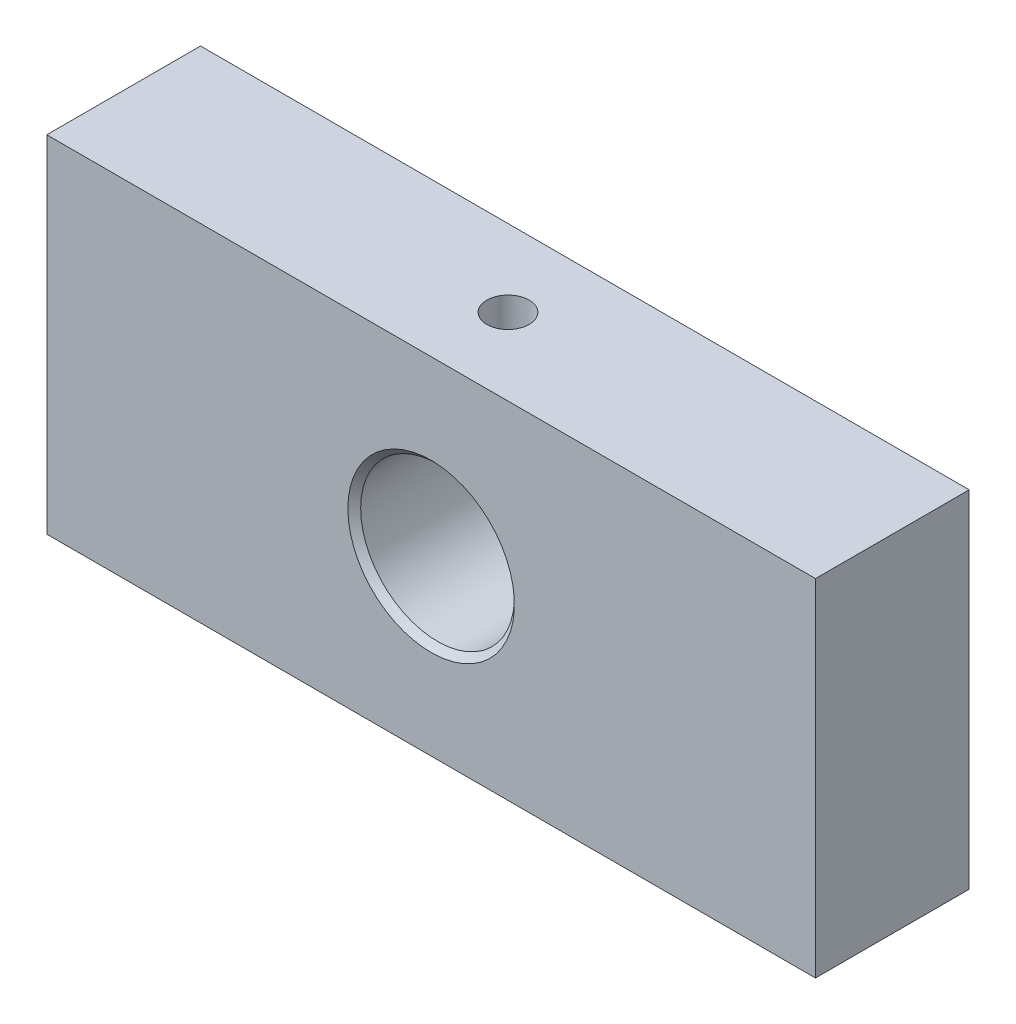
ISO-10303-21;
HEADER;
FILE_DESCRIPTION(('STEP AP214'),'2;1');
FILE_NAME('part.step','',(''),(''),'','','');
FILE_SCHEMA(('AUTOMOTIVE_DESIGN { 1 0 10303 214 1 1 1 1 }'));
ENDSEC;
DATA;
#1=APPLICATION_CONTEXT('core data for automotive mechanical design processes');
#2=APPLICATION_PROTOCOL_DEFINITION('international standard','automotive_design',2000,#1);
#3=PRODUCT_CONTEXT('',#1,'mechanical');
#4=PRODUCT('Part','Part','',(#3));
#5=PRODUCT_RELATED_PRODUCT_CATEGORY('part','',(#4));
#6=PRODUCT_DEFINITION_FORMATION('','',#4);
#7=PRODUCT_DEFINITION_CONTEXT('part definition',#1,'design');
#8=PRODUCT_DEFINITION('design','',#6,#7);
#9=PRODUCT_DEFINITION_SHAPE('','',#8);
#10=(LENGTH_UNIT() NAMED_UNIT(*) SI_UNIT(.MILLI.,.METRE.));
#11=(NAMED_UNIT(*) PLANE_ANGLE_UNIT() SI_UNIT($,.RADIAN.));
#12=(NAMED_UNIT(*) SI_UNIT($,.STERADIAN.) SOLID_ANGLE_UNIT());
#13=UNCERTAINTY_MEASURE_WITH_UNIT(LENGTH_MEASURE(1.E-05),#10,'distance_accuracy_value','');
#14=(GEOMETRIC_REPRESENTATION_CONTEXT(3) GLOBAL_UNCERTAINTY_ASSIGNED_CONTEXT((#13)) GLOBAL_UNIT_ASSIGNED_CONTEXT((#10,
#11,#12)) REPRESENTATION_CONTEXT('',''));
#15=CARTESIAN_POINT('',(0.,0.,0.));
#16=DIRECTION('',(0.,0.,1.));
#17=DIRECTION('',(1.,0.,0.));
#18=AXIS2_PLACEMENT_3D('',#15,#16,#17);
#19=CARTESIAN_POINT('',(0.,0.,12.));
#20=DIRECTION('',(1.,0.,0.));
#21=DIRECTION('',(0.,0.,-1.));
#22=AXIS2_PLACEMENT_3D('',#19,#20,#21);
#23=PLANE('',#22);
#24=DIRECTION('',(0.,-1.,0.));
#25=VECTOR('',#24,1.);
#26=CARTESIAN_POINT('',(0.,0.,0.));
#27=LINE('',#26,#25);
#28=CARTESIAN_POINT('',(0.,27.,0.));
#29=VERTEX_POINT('',#28);
#30=CARTESIAN_POINT('',(0.,0.,0.));
#31=VERTEX_POINT('',#30);
#32=EDGE_CURVE('E138',#29,#31,#27,.T.);
#33=ORIENTED_EDGE('',*,*,#32,.T.);
#34=DIRECTION('',(0.,0.,-1.));
#35=VECTOR('',#34,1.);
#36=CARTESIAN_POINT('',(0.,0.,12.));
#37=LINE('',#36,#35);
#38=CARTESIAN_POINT('',(0.,0.,12.));
#39=VERTEX_POINT('',#38);
#40=EDGE_CURVE('E157',#39,#31,#37,.T.);
#41=ORIENTED_EDGE('',*,*,#40,.F.);
#42=DIRECTION('',(0.,-1.,0.));
#43=VECTOR('',#42,1.);
#44=CARTESIAN_POINT('',(0.,0.,12.));
#45=LINE('',#44,#43);
#46=CARTESIAN_POINT('',(0.,27.,12.));
#47=VERTEX_POINT('',#46);
#48=EDGE_CURVE('E139',#47,#39,#45,.T.);
#49=ORIENTED_EDGE('',*,*,#48,.F.);
#50=DIRECTION('',(0.,0.,-1.));
#51=VECTOR('',#50,1.);
#52=CARTESIAN_POINT('',(0.,27.,12.));
#53=LINE('',#52,#51);
#54=EDGE_CURVE('E145',#47,#29,#53,.T.);
#55=ORIENTED_EDGE('',*,*,#54,.T.);
#56=EDGE_LOOP('',(#33,#41,#49,#55));
#57=FACE_BOUND('',#56,.T.);
#58=ADVANCED_FACE('F36',(#57),#23,.F.);
#59=CARTESIAN_POINT('',(0.,0.,12.));
#60=DIRECTION('',(0.,1.,0.));
#61=DIRECTION('',(0.,0.,1.));
#62=AXIS2_PLACEMENT_3D('',#59,#60,#61);
#63=PLANE('',#62);
#64=CARTESIAN_POINT('',(52.,0.,6.00000000000061));
#65=DIRECTION('',(0.,-1.,0.));
#66=DIRECTION('',(0.,0.,-1.));
#67=AXIS2_PLACEMENT_3D('',#64,#65,#66);
#68=CIRCLE('',#67,2.5);
#69=CARTESIAN_POINT('',(52.,0.,3.50000000000061));
#70=VERTEX_POINT('',#69);
#71=EDGE_CURVE('E109',#70,#70,#68,.T.);
#72=ORIENTED_EDGE('',*,*,#71,.F.);
#73=EDGE_LOOP('',(#72));
#74=FACE_BOUND('',#73,.T.);
#75=CARTESIAN_POINT('',(44.,0.,6.00000000000061));
#76=DIRECTION('',(0.,-1.,0.));
#77=DIRECTION('',(0.,0.,-1.));
#78=AXIS2_PLACEMENT_3D('',#75,#76,#77);
#79=CIRCLE('',#78,2.09999999999999);
#80=CARTESIAN_POINT('',(44.,0.,3.90000000000062));
#81=VERTEX_POINT('',#80);
#82=EDGE_CURVE('E108',#81,#81,#79,.T.);
#83=ORIENTED_EDGE('',*,*,#82,.F.);
#84=EDGE_LOOP('',(#83));
#85=FACE_BOUND('',#84,.T.);
#86=CARTESIAN_POINT('',(16.,0.,6.));
#87=DIRECTION('',(0.,-1.,0.));
#88=DIRECTION('',(0.,0.,-1.));
#89=AXIS2_PLACEMENT_3D('',#86,#87,#88);
#90=CIRCLE('',#89,2.1);
#91=CARTESIAN_POINT('',(16.,0.,3.9));
#92=VERTEX_POINT('',#91);
#93=EDGE_CURVE('E119',#92,#92,#90,.T.);
#94=ORIENTED_EDGE('',*,*,#93,.F.);
#95=EDGE_LOOP('',(#94));
#96=FACE_BOUND('',#95,.T.);
#97=CARTESIAN_POINT('',(8.,0.,6.));
#98=DIRECTION('',(0.,-1.,0.));
#99=DIRECTION('',(0.,0.,-1.));
#100=AXIS2_PLACEMENT_3D('',#97,#98,#99);
#101=CIRCLE('',#100,2.49999999999999);
#102=CARTESIAN_POINT('',(8.,0.,3.50000000000001));
#103=VERTEX_POINT('',#102);
#104=EDGE_CURVE('E125',#103,#103,#101,.T.);
#105=ORIENTED_EDGE('',*,*,#104,.F.);
#106=EDGE_LOOP('',(#105));
#107=FACE_BOUND('',#106,.T.);
#108=DIRECTION('',(1.,0.,0.));
#109=VECTOR('',#108,1.);
#110=CARTESIAN_POINT('',(0.,0.,0.));
#111=LINE('',#110,#109);
#112=CARTESIAN_POINT('',(60.,0.,0.));
#113=VERTEX_POINT('',#112);
#114=EDGE_CURVE('E148',#31,#113,#111,.T.);
#115=ORIENTED_EDGE('',*,*,#114,.T.);
#116=DIRECTION('',(0.,0.,-1.));
#117=VECTOR('',#116,1.);
#118=CARTESIAN_POINT('',(60.,0.,12.));
#119=LINE('',#118,#117);
#120=CARTESIAN_POINT('',(60.,0.,12.));
#121=VERTEX_POINT('',#120);
#122=EDGE_CURVE('E155',#121,#113,#119,.T.);
#123=ORIENTED_EDGE('',*,*,#122,.F.);
#124=DIRECTION('',(1.,0.,0.));
#125=VECTOR('',#124,1.);
#126=CARTESIAN_POINT('',(0.,0.,12.));
#127=LINE('',#126,#125);
#128=EDGE_CURVE('E85',#39,#121,#127,.T.);
#129=ORIENTED_EDGE('',*,*,#128,.F.);
#130=ORIENTED_EDGE('',*,*,#40,.T.);
#131=EDGE_LOOP('',(#115,#123,#129,#130));
#132=FACE_BOUND('',#131,.T.);
#133=ADVANCED_FACE('F201',(#74,#85,#96,#107,#132),#63,.F.);
#134=CARTESIAN_POINT('',(60.,0.,12.));
#135=DIRECTION('',(-1.,0.,0.));
#136=DIRECTION('',(0.,0.,1.));
#137=AXIS2_PLACEMENT_3D('',#134,#135,#136);
#138=PLANE('',#137);
#139=DIRECTION('',(0.,1.,0.));
#140=VECTOR('',#139,1.);
#141=CARTESIAN_POINT('',(60.,0.,0.));
#142=LINE('',#141,#140);
#143=CARTESIAN_POINT('',(60.,27.,0.));
#144=VERTEX_POINT('',#143);
#145=EDGE_CURVE('E71',#113,#144,#142,.T.);
#146=ORIENTED_EDGE('',*,*,#145,.T.);
#147=DIRECTION('',(0.,0.,-1.));
#148=VECTOR('',#147,1.);
#149=CARTESIAN_POINT('',(60.,27.,12.));
#150=LINE('',#149,#148);
#151=CARTESIAN_POINT('',(60.,27.,12.));
#152=VERTEX_POINT('',#151);
#153=EDGE_CURVE('E153',#152,#144,#150,.T.);
#154=ORIENTED_EDGE('',*,*,#153,.F.);
#155=DIRECTION('',(0.,1.,0.));
#156=VECTOR('',#155,1.);
#157=CARTESIAN_POINT('',(60.,0.,12.));
#158=LINE('',#157,#156);
#159=EDGE_CURVE('E142',#121,#152,#158,.T.);
#160=ORIENTED_EDGE('',*,*,#159,.F.);
#161=ORIENTED_EDGE('',*,*,#122,.T.);
#162=EDGE_LOOP('',(#146,#154,#160,#161));
#163=FACE_BOUND('',#162,.T.);
#164=ADVANCED_FACE('F206',(#163),#138,.F.);
#165=CARTESIAN_POINT('',(0.,27.,12.));
#166=DIRECTION('',(0.,-1.,0.));
#167=DIRECTION('',(1.,0.,0.));
#168=AXIS2_PLACEMENT_3D('',#165,#166,#167);
#169=PLANE('',#168);
#170=CARTESIAN_POINT('',(30.,27.,6.));
#171=DIRECTION('',(0.,1.,0.));
#172=DIRECTION('',(0.,0.,1.));
#173=AXIS2_PLACEMENT_3D('',#170,#171,#172);
#174=CIRCLE('',#173,1.64999999999999);
#175=CARTESIAN_POINT('',(30.,27.,7.64999999999999));
#176=VERTEX_POINT('',#175);
#177=EDGE_CURVE('E131',#176,#176,#174,.T.);
#178=ORIENTED_EDGE('',*,*,#177,.F.);
#179=EDGE_LOOP('',(#178));
#180=FACE_BOUND('',#179,.T.);
#181=DIRECTION('',(-1.,0.,0.));
#182=VECTOR('',#181,1.);
#183=CARTESIAN_POINT('',(0.,27.,0.));
#184=LINE('',#183,#182);
#185=EDGE_CURVE('E77',#144,#29,#184,.T.);
#186=ORIENTED_EDGE('',*,*,#185,.T.);
#187=ORIENTED_EDGE('',*,*,#54,.F.);
#188=DIRECTION('',(-1.,0.,0.));
#189=VECTOR('',#188,1.);
#190=CARTESIAN_POINT('',(0.,27.,12.));
#191=LINE('',#190,#189);
#192=EDGE_CURVE('E53',#152,#47,#191,.T.);
#193=ORIENTED_EDGE('',*,*,#192,.F.);
#194=ORIENTED_EDGE('',*,*,#153,.T.);
#195=EDGE_LOOP('',(#186,#187,#193,#194));
#196=FACE_BOUND('',#195,.T.);
#197=ADVANCED_FACE('F212',(#180,#196),#169,.F.);
#198=CARTESIAN_POINT('',(0.,0.,12.));
#199=DIRECTION('',(0.,0.,-1.));
#200=DIRECTION('',(-1.,0.,0.));
#201=AXIS2_PLACEMENT_3D('',#198,#199,#200);
#202=PLANE('',#201);
#203=CARTESIAN_POINT('',(30.,13.5,12.));
#204=DIRECTION('',(0.,0.,-1.));
#205=DIRECTION('',(-1.,0.,0.));
#206=AXIS2_PLACEMENT_3D('',#203,#204,#205);
#207=CIRCLE('',#206,6.5);
#208=CARTESIAN_POINT('',(23.5,13.5,12.));
#209=VERTEX_POINT('',#208);
#210=EDGE_CURVE('E11',#209,#209,#207,.T.);
#211=ORIENTED_EDGE('',*,*,#210,.T.);
#212=EDGE_LOOP('',(#211));
#213=FACE_BOUND('',#212,.T.);
#214=ORIENTED_EDGE('',*,*,#48,.T.);
#215=ORIENTED_EDGE('',*,*,#128,.T.);
#216=ORIENTED_EDGE('',*,*,#159,.T.);
#217=ORIENTED_EDGE('',*,*,#192,.T.);
#218=EDGE_LOOP('',(#214,#215,#216,#217));
#219=FACE_BOUND('',#218,.T.);
#220=ADVANCED_FACE('F215',(#213,#219),#202,.F.);
#221=CARTESIAN_POINT('',(0.,0.,0.));
#222=DIRECTION('',(0.,0.,-1.));
#223=DIRECTION('',(-1.,0.,0.));
#224=AXIS2_PLACEMENT_3D('',#221,#222,#223);
#225=PLANE('',#224);
#226=CARTESIAN_POINT('',(30.,13.5,0.));
#227=DIRECTION('',(0.,0.,-1.));
#228=DIRECTION('',(-1.,0.,0.));
#229=AXIS2_PLACEMENT_3D('',#226,#227,#228);
#230=CIRCLE('',#229,6.);
#231=CARTESIAN_POINT('',(24.,13.5,0.));
#232=VERTEX_POINT('',#231);
#233=EDGE_CURVE('E135',#232,#232,#230,.T.);
#234=ORIENTED_EDGE('',*,*,#233,.F.);
#235=EDGE_LOOP('',(#234));
#236=FACE_BOUND('',#235,.T.);
#237=ORIENTED_EDGE('',*,*,#32,.F.);
#238=ORIENTED_EDGE('',*,*,#185,.F.);
#239=ORIENTED_EDGE('',*,*,#145,.F.);
#240=ORIENTED_EDGE('',*,*,#114,.F.);
#241=EDGE_LOOP('',(#237,#238,#239,#240));
#242=FACE_BOUND('',#241,.T.);
#243=ADVANCED_FACE('F217',(#236,#242),#225,.T.);
#244=CARTESIAN_POINT('',(30.,13.5,12.));
#245=DIRECTION('',(0.,0.,1.));
#246=DIRECTION('',(1.,0.,0.));
#247=AXIS2_PLACEMENT_3D('',#244,#245,#246);
#248=CYLINDRICAL_SURFACE('',#247,6.);
#249=CARTESIAN_POINT('',(30.,13.5,11.5));
#250=DIRECTION('',(0.,0.,-1.));
#251=DIRECTION('',(-1.,0.,0.));
#252=AXIS2_PLACEMENT_3D('',#249,#250,#251);
#253=CIRCLE('',#252,6.);
#254=CARTESIAN_POINT('',(24.,13.5,11.5));
#255=VERTEX_POINT('',#254);
#256=EDGE_CURVE('E45',#255,#255,#253,.F.);
#257=ORIENTED_EDGE('',*,*,#256,.T.);
#258=EDGE_LOOP('',(#257));
#259=FACE_BOUND('',#258,.T.);
#260=CARTESIAN_POINT('',(30.,19.5,7.64999999999999));
#261=CARTESIAN_POINT('',(30.0908537283277,19.4999987430826,7.64999807099644));
#262=CARTESIAN_POINT('',(30.1817277335756,19.4979162279046,7.64247089912751));
#263=CARTESIAN_POINT('',(30.3608510125564,19.4898111762403,7.61261870180665));
#264=CARTESIAN_POINT('',(30.4490991219936,19.4837869184586,7.59028721149157));
#265=CARTESIAN_POINT('',(30.6203596755003,19.4684621535668,7.53161251353508));
#266=CARTESIAN_POINT('',(30.7033789364245,19.4591660207935,7.495288007773));
#267=CARTESIAN_POINT('',(30.8621475322751,19.4382760100701,7.40972952683831));
#268=CARTESIAN_POINT('',(30.93789626133,19.4266819408736,7.36049447707182));
#269=CARTESIAN_POINT('',(31.0818313678109,19.4021262456901,7.24923811997339));
#270=CARTESIAN_POINT('',(31.1498140535122,19.3891400932963,7.18695870420412));
#271=CARTESIAN_POINT('',(31.274513622207,19.3634185780897,7.05193283429948));
#272=CARTESIAN_POINT('',(31.3312289552196,19.350683249998,6.97918494245));
#273=CARTESIAN_POINT('',(31.4327956828804,19.3266524492101,6.82363800281993));
#274=CARTESIAN_POINT('',(31.4774093410968,19.3153878141438,6.74067851730474));
#275=CARTESIAN_POINT('',(31.551973735683,19.2959358909451,6.56807591951321));
#276=CARTESIAN_POINT('',(31.5819273676161,19.2877479951875,6.47843413112039));
#277=CARTESIAN_POINT('',(31.6256075000386,19.2756304093822,6.29727533624054));
#278=CARTESIAN_POINT('',(31.6397048488695,19.2716035913248,6.20585440576672));
#279=CARTESIAN_POINT('',(31.6524289066658,19.2679741883931,6.02186326388271));
#280=CARTESIAN_POINT('',(31.6510587063326,19.268370719652,5.92929328576605));
#281=CARTESIAN_POINT('',(31.6331802186321,19.2734564821543,5.74855455128155));
#282=CARTESIAN_POINT('',(31.6171243582028,19.2780174118175,5.66033685132934));
#283=CARTESIAN_POINT('',(31.571056457029,19.290712125433,5.4878984571429));
#284=CARTESIAN_POINT('',(31.5410432379396,19.2988462110443,5.40367810104466));
#285=CARTESIAN_POINT('',(31.4675525740361,19.3178810068791,5.24046335350015));
#286=CARTESIAN_POINT('',(31.4239194027705,19.3288134380864,5.16154293706776));
#287=CARTESIAN_POINT('',(31.3245359421656,19.3521965018176,5.01198691032996));
#288=CARTESIAN_POINT('',(31.2687831320586,19.3646474499414,4.94135302825628));
#289=CARTESIAN_POINT('',(31.1444455786362,19.3901954366764,4.80779451200269));
#290=CARTESIAN_POINT('',(31.0754819378021,19.4032998839593,4.74522350991207));
#291=CARTESIAN_POINT('',(30.9278791741358,19.4282910595904,4.63245990828775));
#292=CARTESIAN_POINT('',(30.8492396207584,19.4401777337085,4.58226785987435));
#293=CARTESIAN_POINT('',(30.6839470274225,19.4614750412231,4.49551741834778));
#294=CARTESIAN_POINT('',(30.5972569014141,19.4708733610395,4.45902646630247));
#295=CARTESIAN_POINT('',(30.4186541320437,19.4860461745055,4.40124030070411));
#296=CARTESIAN_POINT('',(30.3267427102351,19.4918215119967,4.37994154852353));
#297=CARTESIAN_POINT('',(30.1433215062691,19.4989686066969,4.35370760850692));
#298=CARTESIAN_POINT('',(30.0518853661978,19.5004696048813,4.34829201366682));
#299=CARTESIAN_POINT('',(29.8694101154025,19.4992722923156,4.35264666541254));
#300=CARTESIAN_POINT('',(29.778370961941,19.4965744453723,4.36241523474668));
#301=CARTESIAN_POINT('',(29.601012229792,19.4873663592129,4.3964680614825));
#302=CARTESIAN_POINT('',(29.514636576121,19.4809273447506,4.42048130178517));
#303=CARTESIAN_POINT('',(29.3471503323881,19.4649703176669,4.48202439492076));
#304=CARTESIAN_POINT('',(29.2660403316882,19.455451961099,4.51955575771149));
#305=CARTESIAN_POINT('',(29.1095447040823,19.4340929771281,4.60794021664958));
#306=CARTESIAN_POINT('',(29.0343104963562,19.4222087468833,4.65905061369239));
#307=CARTESIAN_POINT('',(28.8933190328873,19.3974900917771,4.77282154032141));
#308=CARTESIAN_POINT('',(28.8275637769132,19.3846554672735,4.83548450080895));
#309=CARTESIAN_POINT('',(28.7053498427899,19.3590019124566,4.97282845250336));
#310=CARTESIAN_POINT('',(28.6492309619935,19.3461951063632,5.04781465907046));
#311=CARTESIAN_POINT('',(28.5503617951009,19.3224688821406,5.20641351333614));
#312=CARTESIAN_POINT('',(28.5076109842016,19.3115493899268,5.29002582222028));
#313=CARTESIAN_POINT('',(28.4370108318927,19.2929611165989,5.46311233018454));
#314=CARTESIAN_POINT('',(28.4090777273075,19.2852741148417,5.55255029883062));
#315=CARTESIAN_POINT('',(28.3687238079795,19.2740267763645,5.7351035374625));
#316=CARTESIAN_POINT('',(28.3562987183312,19.27046530243,5.82821778674824));
#317=CARTESIAN_POINT('',(28.347570682498,19.2679714749196,6.01198988281324));
#318=CARTESIAN_POINT('',(28.3507198563064,19.2688818021384,6.10261995085517));
#319=CARTESIAN_POINT('',(28.3717712015682,19.2748582836978,6.2820034160007));
#320=CARTESIAN_POINT('',(28.3896729465519,19.2799243179044,6.37075686727777));
#321=CARTESIAN_POINT('',(28.4393945044271,19.2935447800639,6.54312897734824));
#322=CARTESIAN_POINT('',(28.471091273794,19.3020683243948,6.62678574265721));
#323=CARTESIAN_POINT('',(28.5474079003887,19.3216424785397,6.78765860998809));
#324=CARTESIAN_POINT('',(28.5920298998629,19.3326935071987,6.86487364161305));
#325=CARTESIAN_POINT('',(28.6945613212916,19.356507274906,7.01326917305464));
#326=CARTESIAN_POINT('',(28.7528412699432,19.3693126029988,7.08418685503001));
#327=CARTESIAN_POINT('',(28.8803386614604,19.3949622475491,7.21541371112339));
#328=CARTESIAN_POINT('',(28.9495587983537,19.4078065728436,7.27572026449428));
#329=CARTESIAN_POINT('',(29.0989077497507,19.4324434176161,7.38539259257943));
#330=CARTESIAN_POINT('',(29.1792522908768,19.4442046427709,7.43447225610963));
#331=CARTESIAN_POINT('',(29.3473741273614,19.4650006337912,7.51835186671289));
#332=CARTESIAN_POINT('',(29.435146915075,19.4740370381673,7.55316039996171));
#333=CARTESIAN_POINT('',(29.602080341257,19.4872859746761,7.60330363251497));
#334=CARTESIAN_POINT('',(29.6805650834511,19.4920179104802,7.62077254795139));
#335=CARTESIAN_POINT('',(29.8393614051269,19.4983753034331,7.64412093024871));
#336=CARTESIAN_POINT('',(29.9196727773314,19.5000011112883,7.6500017055051));
#337=CARTESIAN_POINT('',(30.,19.5,7.64999999999999));
#338=B_SPLINE_CURVE_WITH_KNOTS('',3,(#260,#261,#262,#263,#264,#265,#266,#267,#268,#269,#270,
#271,#272,#273,#274,#275,#276,#277,#278,#279,#280,#281,#282,#283,#284,#285,#286,#287,#288,#289,
#290,#291,#292,#293,#294,#295,#296,#297,#298,#299,#300,#301,#302,#303,#304,#305,#306,#307,#308,
#309,#310,#311,#312,#313,#314,#315,#316,#317,#318,#319,#320,#321,#322,#323,#324,#325,#326,#327,
#328,#329,#330,#331,#332,#333,#334,#335,#336,#337),.UNSPECIFIED.,.T.,.F.,(4,2,2,2,2,2,2,2,2,2,2,
2,2,2,2,2,2,2,2,2,2,2,2,2,2,2,2,2,2,2,2,2,2,2,2,2,2,2,4),(0.,0.27226649123506,0.544651956274201,
0.816674629991572,1.08871995238569,1.36676668474294,1.64485163984641,1.92805811024661,
2.21120862075007,2.48758935156343,2.76391485738985,3.03200413559446,3.30011605124615,
3.5714132909473,3.84276701193226,4.12355975427326,4.40436499546187,4.68653487032461,
4.96863899957844,5.2421177623009,5.51556631854549,5.78397200237259,6.05240767608965,
6.32634577802892,6.60034158820942,6.88259284524949,7.16483302029482,7.44546024030149,
7.72601008612318,7.996762285491,8.2675066581848,8.53588411360164,8.8043060757622,
9.08108736952949,9.35793692735374,9.64120588287098,9.92430415962324,10.1650524617277,
10.4057735798283),.UNSPECIFIED.);
#339=CARTESIAN_POINT('',(30.,19.5,7.64999999999999));
#340=VERTEX_POINT('',#339);
#341=EDGE_CURVE('E134',#340,#340,#338,.T.);
#342=ORIENTED_EDGE('',*,*,#341,.T.);
#343=EDGE_LOOP('',(#342));
#344=FACE_BOUND('',#343,.T.);
#345=ORIENTED_EDGE('',*,*,#233,.T.);
#346=EDGE_LOOP('',(#345));
#347=FACE_BOUND('',#346,.T.);
#348=ADVANCED_FACE('F165',(#259,#344,#347),#248,.F.);
#349=CARTESIAN_POINT('',(30.,27.,6.));
#350=DIRECTION('',(0.,1.,0.));
#351=DIRECTION('',(0.,0.,1.));
#352=AXIS2_PLACEMENT_3D('',#349,#350,#351);
#353=CYLINDRICAL_SURFACE('',#352,1.64999999999999);
#354=ORIENTED_EDGE('',*,*,#177,.T.);
#355=EDGE_LOOP('',(#354));
#356=FACE_BOUND('',#355,.T.);
#357=ORIENTED_EDGE('',*,*,#341,.F.);
#358=EDGE_LOOP('',(#357));
#359=FACE_BOUND('',#358,.T.);
#360=ADVANCED_FACE('F168',(#356,#359),#353,.F.);
#361=CARTESIAN_POINT('',(30.,13.5,11.5));
#362=DIRECTION('',(0.,0.,1.));
#363=DIRECTION('',(1.,0.,0.));
#364=AXIS2_PLACEMENT_3D('',#361,#362,#363);
#365=CONICAL_SURFACE('',#364,6.,0.785398163397455);
#366=ORIENTED_EDGE('',*,*,#210,.F.);
#367=EDGE_LOOP('',(#366));
#368=FACE_BOUND('',#367,.T.);
#369=ORIENTED_EDGE('',*,*,#256,.F.);
#370=EDGE_LOOP('',(#369));
#371=FACE_BOUND('',#370,.T.);
#372=ADVANCED_FACE('F38',(#368,#371),#365,.F.);
#373=CARTESIAN_POINT('',(8.,9.99999999999999,6.));
#374=DIRECTION('',(0.,-1.,0.));
#375=DIRECTION('',(0.,0.,-1.));
#376=AXIS2_PLACEMENT_3D('',#373,#374,#375);
#377=CONICAL_SURFACE('',#376,2.49999999999999,1.02974425867665);
#378=CARTESIAN_POINT('',(8.,11.5021515475689,6.));
#379=VERTEX_POINT('',#378);
#380=VERTEX_LOOP('',#379);
#381=FACE_BOUND('',#380,.T.);
#382=CARTESIAN_POINT('',(8.,9.99999999999999,6.));
#383=DIRECTION('',(0.,-1.,0.));
#384=DIRECTION('',(0.,0.,-1.));
#385=AXIS2_PLACEMENT_3D('',#382,#383,#384);
#386=CIRCLE('',#385,2.49999999999999);
#387=CARTESIAN_POINT('',(8.,9.99999999999999,3.50000000000001));
#388=VERTEX_POINT('',#387);
#389=EDGE_CURVE('E128',#388,#388,#386,.T.);
#390=ORIENTED_EDGE('',*,*,#389,.T.);
#391=EDGE_LOOP('',(#390));
#392=FACE_BOUND('',#391,.T.);
#393=ADVANCED_FACE('F173',(#381,#392),#377,.F.);
#394=CARTESIAN_POINT('',(8.,0.,6.));
#395=DIRECTION('',(0.,-1.,0.));
#396=DIRECTION('',(0.,0.,-1.));
#397=AXIS2_PLACEMENT_3D('',#394,#395,#396);
#398=CYLINDRICAL_SURFACE('',#397,2.49999999999999);
#399=ORIENTED_EDGE('',*,*,#389,.F.);
#400=EDGE_LOOP('',(#399));
#401=FACE_BOUND('',#400,.T.);
#402=ORIENTED_EDGE('',*,*,#104,.T.);
#403=EDGE_LOOP('',(#402));
#404=FACE_BOUND('',#403,.T.);
#405=ADVANCED_FACE('F176',(#401,#404),#398,.F.);
#406=CARTESIAN_POINT('',(16.,10.,6.));
#407=DIRECTION('',(0.,-1.,0.));
#408=DIRECTION('',(0.,0.,-1.));
#409=AXIS2_PLACEMENT_3D('',#406,#407,#408);
#410=CONICAL_SURFACE('',#409,2.1,1.02974425867665);
#411=CARTESIAN_POINT('',(16.,11.2618072999579,6.));
#412=VERTEX_POINT('',#411);
#413=VERTEX_LOOP('',#412);
#414=FACE_BOUND('',#413,.T.);
#415=CARTESIAN_POINT('',(16.,10.,6.));
#416=DIRECTION('',(0.,-1.,0.));
#417=DIRECTION('',(0.,0.,-1.));
#418=AXIS2_PLACEMENT_3D('',#415,#416,#417);
#419=CIRCLE('',#418,2.1);
#420=CARTESIAN_POINT('',(16.,10.,3.9));
#421=VERTEX_POINT('',#420);
#422=EDGE_CURVE('E122',#421,#421,#419,.T.);
#423=ORIENTED_EDGE('',*,*,#422,.T.);
#424=EDGE_LOOP('',(#423));
#425=FACE_BOUND('',#424,.T.);
#426=ADVANCED_FACE('F180',(#414,#425),#410,.F.);
#427=CARTESIAN_POINT('',(16.,0.,6.));
#428=DIRECTION('',(0.,-1.,0.));
#429=DIRECTION('',(0.,0.,-1.));
#430=AXIS2_PLACEMENT_3D('',#427,#428,#429);
#431=CYLINDRICAL_SURFACE('',#430,2.1);
#432=ORIENTED_EDGE('',*,*,#422,.F.);
#433=EDGE_LOOP('',(#432));
#434=FACE_BOUND('',#433,.T.);
#435=ORIENTED_EDGE('',*,*,#93,.T.);
#436=EDGE_LOOP('',(#435));
#437=FACE_BOUND('',#436,.T.);
#438=ADVANCED_FACE('F184',(#434,#437),#431,.F.);
#439=CARTESIAN_POINT('',(44.,10.,6.00000000000061));
#440=DIRECTION('',(0.,-1.,0.));
#441=DIRECTION('',(0.,0.,-1.));
#442=AXIS2_PLACEMENT_3D('',#439,#440,#441);
#443=CONICAL_SURFACE('',#442,2.1,1.02974425867665);
#444=CARTESIAN_POINT('',(44.,11.2618072999579,6.00000000000061));
#445=VERTEX_POINT('',#444);
#446=VERTEX_LOOP('',#445);
#447=FACE_BOUND('',#446,.T.);
#448=CARTESIAN_POINT('',(44.,10.,6.00000000000061));
#449=DIRECTION('',(0.,-1.,0.));
#450=DIRECTION('',(0.,0.,-1.));
#451=AXIS2_PLACEMENT_3D('',#448,#449,#450);
#452=CIRCLE('',#451,2.1);
#453=CARTESIAN_POINT('',(44.,10.,3.90000000000062));
#454=VERTEX_POINT('',#453);
#455=EDGE_CURVE('E112',#454,#454,#452,.T.);
#456=ORIENTED_EDGE('',*,*,#455,.T.);
#457=EDGE_LOOP('',(#456));
#458=FACE_BOUND('',#457,.T.);
#459=ADVANCED_FACE('F188',(#447,#458),#443,.F.);
#460=CARTESIAN_POINT('',(44.,0.,6.00000000000061));
#461=DIRECTION('',(0.,-1.,0.));
#462=DIRECTION('',(0.,0.,-1.));
#463=AXIS2_PLACEMENT_3D('',#460,#461,#462);
#464=CYLINDRICAL_SURFACE('',#463,2.09999999999999);
#465=ORIENTED_EDGE('',*,*,#455,.F.);
#466=EDGE_LOOP('',(#465));
#467=FACE_BOUND('',#466,.T.);
#468=ORIENTED_EDGE('',*,*,#82,.T.);
#469=EDGE_LOOP('',(#468));
#470=FACE_BOUND('',#469,.T.);
#471=ADVANCED_FACE('F102',(#467,#470),#464,.F.);
#472=CARTESIAN_POINT('',(52.,12.4,6.00000000000061));
#473=DIRECTION('',(0.,-1.,0.));
#474=DIRECTION('',(0.,0.,-1.));
#475=AXIS2_PLACEMENT_3D('',#472,#473,#474);
#476=CONICAL_SURFACE('',#475,2.5,1.02974425867665);
#477=CARTESIAN_POINT('',(52.,13.9021515475689,6.00000000000061));
#478=VERTEX_POINT('',#477);
#479=VERTEX_LOOP('',#478);
#480=FACE_BOUND('',#479,.T.);
#481=CARTESIAN_POINT('',(52.,12.4,6.00000000000061));
#482=DIRECTION('',(0.,-1.,0.));
#483=DIRECTION('',(0.,0.,-1.));
#484=AXIS2_PLACEMENT_3D('',#481,#482,#483);
#485=CIRCLE('',#484,2.5);
#486=CARTESIAN_POINT('',(52.,12.4,3.50000000000062));
#487=VERTEX_POINT('',#486);
#488=EDGE_CURVE('E106',#487,#487,#485,.T.);
#489=ORIENTED_EDGE('',*,*,#488,.T.);
#490=EDGE_LOOP('',(#489));
#491=FACE_BOUND('',#490,.T.);
#492=ADVANCED_FACE('F98',(#480,#491),#476,.F.);
#493=CARTESIAN_POINT('',(52.,0.,6.00000000000061));
#494=DIRECTION('',(0.,-1.,0.));
#495=DIRECTION('',(0.,0.,-1.));
#496=AXIS2_PLACEMENT_3D('',#493,#494,#495);
#497=CYLINDRICAL_SURFACE('',#496,2.5);
#498=ORIENTED_EDGE('',*,*,#488,.F.);
#499=EDGE_LOOP('',(#498));
#500=FACE_BOUND('',#499,.T.);
#501=ORIENTED_EDGE('',*,*,#71,.T.);
#502=EDGE_LOOP('',(#501));
#503=FACE_BOUND('',#502,.T.);
#504=ADVANCED_FACE('F101',(#500,#503),#497,.F.);
#505=CLOSED_SHELL('',(#58,#133,#164,#197,#220,#243,#348,#360,#372,#393,#405,#426,#438,#459,#471,
#492,#504));
#506=MANIFOLD_SOLID_BREP('B2',#505);
#507=ADVANCED_BREP_SHAPE_REPRESENTATION('',(#18,#506),#14);
#508=SHAPE_DEFINITION_REPRESENTATION(#9,#507);
ENDSEC;
END-ISO-10303-21;
